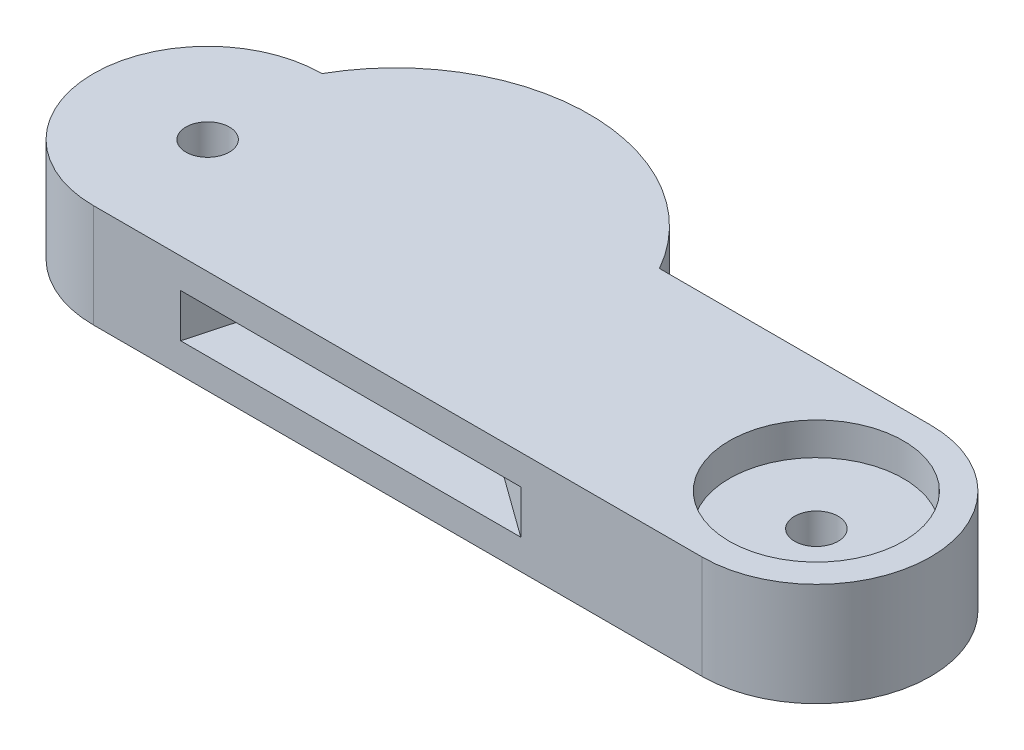
ISO-10303-21;
HEADER;
FILE_DESCRIPTION(('STEP AP214'),'2;1');
FILE_NAME('part.step','',(''),(''),'','','');
FILE_SCHEMA(('AUTOMOTIVE_DESIGN { 1 0 10303 214 1 1 1 1 }'));
ENDSEC;
DATA;
#1=APPLICATION_CONTEXT('core data for automotive mechanical design processes');
#2=APPLICATION_PROTOCOL_DEFINITION('international standard','automotive_design',2000,#1);
#3=PRODUCT_CONTEXT('',#1,'mechanical');
#4=PRODUCT('Part','Part','',(#3));
#5=PRODUCT_RELATED_PRODUCT_CATEGORY('part','',(#4));
#6=PRODUCT_DEFINITION_FORMATION('','',#4);
#7=PRODUCT_DEFINITION_CONTEXT('part definition',#1,'design');
#8=PRODUCT_DEFINITION('design','',#6,#7);
#9=PRODUCT_DEFINITION_SHAPE('','',#8);
#10=(LENGTH_UNIT() NAMED_UNIT(*) SI_UNIT(.MILLI.,.METRE.));
#11=(NAMED_UNIT(*) PLANE_ANGLE_UNIT() SI_UNIT($,.RADIAN.));
#12=(NAMED_UNIT(*) SI_UNIT($,.STERADIAN.) SOLID_ANGLE_UNIT());
#13=UNCERTAINTY_MEASURE_WITH_UNIT(LENGTH_MEASURE(1.E-05),#10,'distance_accuracy_value','');
#14=(GEOMETRIC_REPRESENTATION_CONTEXT(3) GLOBAL_UNCERTAINTY_ASSIGNED_CONTEXT((#13)) GLOBAL_UNIT_ASSIGNED_CONTEXT((#10,
#11,#12)) REPRESENTATION_CONTEXT('',''));
#15=CARTESIAN_POINT('',(0.,0.,0.));
#16=DIRECTION('',(0.,0.,1.));
#17=DIRECTION('',(1.,0.,0.));
#18=AXIS2_PLACEMENT_3D('',#15,#16,#17);
#19=CARTESIAN_POINT('',(0.,4.75,0.));
#20=DIRECTION('',(0.,-1.,0.));
#21=DIRECTION('',(0.,0.,-1.));
#22=AXIS2_PLACEMENT_3D('',#19,#20,#21);
#23=CYLINDRICAL_SURFACE('',#22,2.);
#24=CARTESIAN_POINT('',(0.,-4.75,0.));
#25=DIRECTION('',(0.,1.,0.));
#26=DIRECTION('',(0.,0.,1.));
#27=AXIS2_PLACEMENT_3D('',#24,#25,#26);
#28=CIRCLE('',#27,2.);
#29=CARTESIAN_POINT('',(0.,-4.75,2.));
#30=VERTEX_POINT('',#29);
#31=EDGE_CURVE('E177',#30,#30,#28,.T.);
#32=ORIENTED_EDGE('',*,*,#31,.F.);
#33=EDGE_LOOP('',(#32));
#34=FACE_BOUND('',#33,.T.);
#35=CARTESIAN_POINT('',(0.,1.75,0.));
#36=DIRECTION('',(0.,1.,0.));
#37=DIRECTION('',(0.,0.,1.));
#38=AXIS2_PLACEMENT_3D('',#35,#36,#37);
#39=CIRCLE('',#38,2.);
#40=CARTESIAN_POINT('',(0.,1.75,2.));
#41=VERTEX_POINT('',#40);
#42=EDGE_CURVE('E40',#41,#41,#39,.T.);
#43=ORIENTED_EDGE('',*,*,#42,.T.);
#44=EDGE_LOOP('',(#43));
#45=FACE_BOUND('',#44,.T.);
#46=ADVANCED_FACE('F36',(#34,#45),#23,.F.);
#47=CARTESIAN_POINT('',(-40.424119315667,37.0570550281998,-1.74605110135798));
#48=DIRECTION('',(0.,-1.,0.));
#49=DIRECTION('',(0.,0.,-1.));
#50=AXIS2_PLACEMENT_3D('',#47,#48,#49);
#51=CYLINDRICAL_SURFACE('',#50,17.8069548217707);
#52=CARTESIAN_POINT('',(-40.424119315667,4.75,-1.74605110135798));
#53=DIRECTION('',(0.,1.,0.));
#54=DIRECTION('',(0.,0.,1.));
#55=AXIS2_PLACEMENT_3D('',#52,#53,#54);
#56=CIRCLE('',#55,17.8069548217707);
#57=CARTESIAN_POINT('',(-24.9177003511623,4.75,-10.5003992165423));
#58=VERTEX_POINT('',#57);
#59=CARTESIAN_POINT('',(-55.9305382801716,4.75,-10.5003992165423));
#60=VERTEX_POINT('',#59);
#61=EDGE_CURVE('E153',#58,#60,#56,.T.);
#62=ORIENTED_EDGE('',*,*,#61,.F.);
#63=DIRECTION('',(0.,-1.,0.));
#64=VECTOR('',#63,1.);
#65=CARTESIAN_POINT('',(-24.9177003511623,37.0570550281998,-10.5003992165423));
#66=LINE('',#65,#64);
#67=CARTESIAN_POINT('',(-24.9177003511623,-4.75,-10.5003992165423));
#68=VERTEX_POINT('',#67);
#69=EDGE_CURVE('E152',#58,#68,#66,.T.);
#70=ORIENTED_EDGE('',*,*,#69,.T.);
#71=CARTESIAN_POINT('',(-40.424119315667,-4.75,-1.74605110135798));
#72=DIRECTION('',(0.,1.,0.));
#73=DIRECTION('',(0.,0.,1.));
#74=AXIS2_PLACEMENT_3D('',#71,#72,#73);
#75=CIRCLE('',#74,17.8069548217707);
#76=CARTESIAN_POINT('',(-55.9305382801716,-4.75,-10.5003992165423));
#77=VERTEX_POINT('',#76);
#78=EDGE_CURVE('E148',#77,#68,#75,.F.);
#79=ORIENTED_EDGE('',*,*,#78,.F.);
#80=DIRECTION('',(0.,-1.,0.));
#81=VECTOR('',#80,1.);
#82=CARTESIAN_POINT('',(-55.9305382801716,4.75,-10.5003992165423));
#83=LINE('',#82,#81);
#84=EDGE_CURVE('E208',#60,#77,#83,.T.);
#85=ORIENTED_EDGE('',*,*,#84,.F.);
#86=EDGE_LOOP('',(#62,#70,#79,#85));
#87=FACE_BOUND('',#86,.T.);
#88=CARTESIAN_POINT('',(-40.424119315667,-2.,-1.74605110135798));
#89=DIRECTION('',(0.,1.,0.));
#90=DIRECTION('',(0.,0.,1.));
#91=AXIS2_PLACEMENT_3D('',#88,#89,#90);
#92=CIRCLE('',#91,17.8069548217707);
#93=CARTESIAN_POINT('',(-35.7381547906298,-2.,-18.9253810211969));
#94=VERTEX_POINT('',#93);
#95=CARTESIAN_POINT('',(-54.8543825264001,-2.,-12.1794179449777));
#96=VERTEX_POINT('',#95);
#97=EDGE_CURVE('E123',#94,#96,#92,.T.);
#98=ORIENTED_EDGE('',*,*,#97,.F.);
#99=DIRECTION('',(0.,1.,0.));
#100=VECTOR('',#99,1.);
#101=CARTESIAN_POINT('',(-35.7381547906298,-2.,-18.9253810211969));
#102=LINE('',#101,#100);
#103=CARTESIAN_POINT('',(-35.7381547906298,2.,-18.9253810211969));
#104=VERTEX_POINT('',#103);
#105=EDGE_CURVE('E133',#94,#104,#102,.T.);
#106=ORIENTED_EDGE('',*,*,#105,.T.);
#107=CARTESIAN_POINT('',(-40.424119315667,2.,-1.74605110135798));
#108=DIRECTION('',(0.,1.,0.));
#109=DIRECTION('',(0.,0.,1.));
#110=AXIS2_PLACEMENT_3D('',#107,#108,#109);
#111=CIRCLE('',#110,17.8069548217707);
#112=CARTESIAN_POINT('',(-54.8543825264001,2.,-12.1794179449777));
#113=VERTEX_POINT('',#112);
#114=EDGE_CURVE('E141',#104,#113,#111,.T.);
#115=ORIENTED_EDGE('',*,*,#114,.T.);
#116=DIRECTION('',(0.,1.,0.));
#117=VECTOR('',#116,1.);
#118=CARTESIAN_POINT('',(-54.8543825264001,-2.,-12.1794179449777));
#119=LINE('',#118,#117);
#120=EDGE_CURVE('E138',#96,#113,#119,.T.);
#121=ORIENTED_EDGE('',*,*,#120,.F.);
#122=EDGE_LOOP('',(#98,#106,#115,#121));
#123=FACE_BOUND('',#122,.T.);
#124=ADVANCED_FACE('F140',(#87,#123),#51,.T.);
#125=CARTESIAN_POINT('',(0.,4.75,-10.5003992165423));
#126=DIRECTION('',(0.,0.,1.));
#127=DIRECTION('',(1.,0.,0.));
#128=AXIS2_PLACEMENT_3D('',#125,#126,#127);
#129=PLANE('',#128);
#130=ORIENTED_EDGE('',*,*,#69,.F.);
#131=DIRECTION('',(-1.,0.,0.));
#132=VECTOR('',#131,1.);
#133=CARTESIAN_POINT('',(0.,4.75,-10.5003992165423));
#134=LINE('',#133,#132);
#135=CARTESIAN_POINT('',(0.,4.75,-10.5003992165423));
#136=VERTEX_POINT('',#135);
#137=EDGE_CURVE('E186',#136,#58,#134,.T.);
#138=ORIENTED_EDGE('',*,*,#137,.F.);
#139=DIRECTION('',(0.,-1.,0.));
#140=VECTOR('',#139,1.);
#141=CARTESIAN_POINT('',(0.,4.75,-10.5003992165423));
#142=LINE('',#141,#140);
#143=CARTESIAN_POINT('',(0.,-4.75,-10.5003992165423));
#144=VERTEX_POINT('',#143);
#145=EDGE_CURVE('E211',#136,#144,#142,.T.);
#146=ORIENTED_EDGE('',*,*,#145,.T.);
#147=DIRECTION('',(-1.,0.,0.));
#148=VECTOR('',#147,1.);
#149=CARTESIAN_POINT('',(0.,-4.75,-10.5003992165423));
#150=LINE('',#149,#148);
#151=EDGE_CURVE('E197',#144,#68,#150,.T.);
#152=ORIENTED_EDGE('',*,*,#151,.T.);
#153=EDGE_LOOP('',(#130,#138,#146,#152));
#154=FACE_BOUND('',#153,.T.);
#155=ADVANCED_FACE('F246',(#154),#129,.F.);
#156=CARTESIAN_POINT('',(0.,4.75,10.5003992165423));
#157=DIRECTION('',(0.,0.,-1.));
#158=DIRECTION('',(-1.,0.,0.));
#159=AXIS2_PLACEMENT_3D('',#156,#157,#158);
#160=PLANE('',#159);
#161=DIRECTION('',(1.,0.,0.));
#162=VECTOR('',#161,1.);
#163=CARTESIAN_POINT('',(0.,-4.75,10.5003992165423));
#164=LINE('',#163,#162);
#165=CARTESIAN_POINT('',(-55.9305382801716,-4.75,10.5003992165423));
#166=VERTEX_POINT('',#165);
#167=CARTESIAN_POINT('',(0.,-4.75,10.5003992165423));
#168=VERTEX_POINT('',#167);
#169=EDGE_CURVE('E187',#166,#168,#164,.T.);
#170=ORIENTED_EDGE('',*,*,#169,.T.);
#171=DIRECTION('',(0.,-1.,0.));
#172=VECTOR('',#171,1.);
#173=CARTESIAN_POINT('',(0.,4.75,10.5003992165423));
#174=LINE('',#173,#172);
#175=CARTESIAN_POINT('',(0.,4.75,10.5003992165423));
#176=VERTEX_POINT('',#175);
#177=EDGE_CURVE('E194',#176,#168,#174,.T.);
#178=ORIENTED_EDGE('',*,*,#177,.F.);
#179=DIRECTION('',(1.,0.,0.));
#180=VECTOR('',#179,1.);
#181=CARTESIAN_POINT('',(0.,4.75,10.5003992165423));
#182=LINE('',#181,#180);
#183=CARTESIAN_POINT('',(-55.9305382801716,4.75,10.5003992165423));
#184=VERTEX_POINT('',#183);
#185=EDGE_CURVE('E192',#184,#176,#182,.T.);
#186=ORIENTED_EDGE('',*,*,#185,.F.);
#187=DIRECTION('',(0.,-1.,0.));
#188=VECTOR('',#187,1.);
#189=CARTESIAN_POINT('',(-55.9305382801716,4.75,10.5003992165423));
#190=LINE('',#189,#188);
#191=EDGE_CURVE('E205',#184,#166,#190,.T.);
#192=ORIENTED_EDGE('',*,*,#191,.T.);
#193=EDGE_LOOP('',(#170,#178,#186,#192));
#194=FACE_BOUND('',#193,.T.);
#195=DIRECTION('',(1.,0.,0.));
#196=VECTOR('',#195,1.);
#197=CARTESIAN_POINT('',(0.,-2.,10.5003992165423));
#198=LINE('',#197,#196);
#199=CARTESIAN_POINT('',(-47.9106890267398,-2.,10.5003992165423));
#200=VERTEX_POINT('',#199);
#201=CARTESIAN_POINT('',(-16.6592767209511,-2.,10.5003992165423));
#202=VERTEX_POINT('',#201);
#203=EDGE_CURVE('E11',#200,#202,#198,.T.);
#204=ORIENTED_EDGE('',*,*,#203,.F.);
#205=DIRECTION('',(0.,1.,0.));
#206=VECTOR('',#205,1.);
#207=CARTESIAN_POINT('',(-47.9106890267398,4.75,10.5003992165423));
#208=LINE('',#207,#206);
#209=CARTESIAN_POINT('',(-47.9106890267398,2.,10.5003992165423));
#210=VERTEX_POINT('',#209);
#211=EDGE_CURVE('E217',#200,#210,#208,.T.);
#212=ORIENTED_EDGE('',*,*,#211,.T.);
#213=DIRECTION('',(1.,0.,0.));
#214=VECTOR('',#213,1.);
#215=CARTESIAN_POINT('',(0.,2.,10.5003992165423));
#216=LINE('',#215,#214);
#217=CARTESIAN_POINT('',(-16.6592767209511,2.,10.5003992165423));
#218=VERTEX_POINT('',#217);
#219=EDGE_CURVE('E214',#210,#218,#216,.T.);
#220=ORIENTED_EDGE('',*,*,#219,.T.);
#221=DIRECTION('',(0.,-1.,0.));
#222=VECTOR('',#221,1.);
#223=CARTESIAN_POINT('',(-16.6592767209511,4.75,10.5003992165423));
#224=LINE('',#223,#222);
#225=EDGE_CURVE('E45',#218,#202,#224,.T.);
#226=ORIENTED_EDGE('',*,*,#225,.T.);
#227=EDGE_LOOP('',(#204,#212,#220,#226));
#228=FACE_BOUND('',#227,.T.);
#229=ADVANCED_FACE('F223',(#194,#228),#160,.F.);
#230=CARTESIAN_POINT('',(0.,4.75,0.));
#231=DIRECTION('',(0.,1.,0.));
#232=DIRECTION('',(0.,0.,1.));
#233=AXIS2_PLACEMENT_3D('',#230,#231,#232);
#234=PLANE('',#233);
#235=CARTESIAN_POINT('',(0.,4.75,0.));
#236=DIRECTION('',(0.,1.,0.));
#237=DIRECTION('',(0.,0.,1.));
#238=AXIS2_PLACEMENT_3D('',#235,#236,#237);
#239=CIRCLE('',#238,8.);
#240=CARTESIAN_POINT('',(0.,4.75,8.));
#241=VERTEX_POINT('',#240);
#242=EDGE_CURVE('E145',#241,#241,#239,.T.);
#243=ORIENTED_EDGE('',*,*,#242,.F.);
#244=EDGE_LOOP('',(#243));
#245=FACE_BOUND('',#244,.T.);
#246=CARTESIAN_POINT('',(0.,4.75,0.));
#247=DIRECTION('',(0.,1.,0.));
#248=DIRECTION('',(0.,0.,1.));
#249=AXIS2_PLACEMENT_3D('',#246,#247,#248);
#250=CIRCLE('',#249,10.5003992165423);
#251=EDGE_CURVE('E183',#176,#136,#250,.T.);
#252=ORIENTED_EDGE('',*,*,#251,.T.);
#253=ORIENTED_EDGE('',*,*,#137,.T.);
#254=ORIENTED_EDGE('',*,*,#61,.T.);
#255=CARTESIAN_POINT('',(-55.9305382801716,4.75,0.));
#256=DIRECTION('',(0.,1.,0.));
#257=DIRECTION('',(0.,0.,1.));
#258=AXIS2_PLACEMENT_3D('',#255,#256,#257);
#259=CIRCLE('',#258,10.5003992165423);
#260=EDGE_CURVE('E190',#60,#184,#259,.T.);
#261=ORIENTED_EDGE('',*,*,#260,.T.);
#262=ORIENTED_EDGE('',*,*,#185,.T.);
#263=EDGE_LOOP('',(#252,#253,#254,#261,#262));
#264=FACE_BOUND('',#263,.T.);
#265=CARTESIAN_POINT('',(-55.9305382801716,4.75,0.));
#266=DIRECTION('',(0.,1.,0.));
#267=DIRECTION('',(0.,0.,1.));
#268=AXIS2_PLACEMENT_3D('',#265,#266,#267);
#269=CIRCLE('',#268,2.);
#270=CARTESIAN_POINT('',(-55.9305382801716,4.75,2.));
#271=VERTEX_POINT('',#270);
#272=EDGE_CURVE('E174',#271,#271,#269,.T.);
#273=ORIENTED_EDGE('',*,*,#272,.F.);
#274=EDGE_LOOP('',(#273));
#275=FACE_BOUND('',#274,.T.);
#276=ADVANCED_FACE('F255',(#245,#264,#275),#234,.T.);
#277=CARTESIAN_POINT('',(0.,-4.75,0.));
#278=DIRECTION('',(0.,1.,0.));
#279=DIRECTION('',(0.,0.,1.));
#280=AXIS2_PLACEMENT_3D('',#277,#278,#279);
#281=PLANE('',#280);
#282=CARTESIAN_POINT('',(0.,-4.75,0.));
#283=DIRECTION('',(0.,1.,0.));
#284=DIRECTION('',(0.,0.,1.));
#285=AXIS2_PLACEMENT_3D('',#282,#283,#284);
#286=CIRCLE('',#285,10.5003992165423);
#287=EDGE_CURVE('E182',#168,#144,#286,.T.);
#288=ORIENTED_EDGE('',*,*,#287,.F.);
#289=ORIENTED_EDGE('',*,*,#169,.F.);
#290=CARTESIAN_POINT('',(-55.9305382801716,-4.75,0.));
#291=DIRECTION('',(0.,1.,0.));
#292=DIRECTION('',(0.,0.,1.));
#293=AXIS2_PLACEMENT_3D('',#290,#291,#292);
#294=CIRCLE('',#293,10.5003992165423);
#295=EDGE_CURVE('E200',#77,#166,#294,.T.);
#296=ORIENTED_EDGE('',*,*,#295,.F.);
#297=ORIENTED_EDGE('',*,*,#78,.T.);
#298=ORIENTED_EDGE('',*,*,#151,.F.);
#299=EDGE_LOOP('',(#288,#289,#296,#297,#298));
#300=FACE_BOUND('',#299,.T.);
#301=ORIENTED_EDGE('',*,*,#31,.T.);
#302=EDGE_LOOP('',(#301));
#303=FACE_BOUND('',#302,.T.);
#304=CARTESIAN_POINT('',(-55.9305382801716,-4.75,0.));
#305=DIRECTION('',(0.,1.,0.));
#306=DIRECTION('',(0.,0.,1.));
#307=AXIS2_PLACEMENT_3D('',#304,#305,#306);
#308=CIRCLE('',#307,2.);
#309=CARTESIAN_POINT('',(-55.9305382801716,-4.75,2.));
#310=VERTEX_POINT('',#309);
#311=EDGE_CURVE('E172',#310,#310,#308,.T.);
#312=ORIENTED_EDGE('',*,*,#311,.T.);
#313=EDGE_LOOP('',(#312));
#314=FACE_BOUND('',#313,.T.);
#315=ADVANCED_FACE('F258',(#300,#303,#314),#281,.F.);
#316=CARTESIAN_POINT('',(0.,4.75,0.));
#317=DIRECTION('',(0.,-1.,0.));
#318=DIRECTION('',(0.,0.,-1.));
#319=AXIS2_PLACEMENT_3D('',#316,#317,#318);
#320=CYLINDRICAL_SURFACE('',#319,10.5003992165423);
#321=ORIENTED_EDGE('',*,*,#287,.T.);
#322=ORIENTED_EDGE('',*,*,#145,.F.);
#323=ORIENTED_EDGE('',*,*,#251,.F.);
#324=ORIENTED_EDGE('',*,*,#177,.T.);
#325=EDGE_LOOP('',(#321,#322,#323,#324));
#326=FACE_BOUND('',#325,.T.);
#327=ADVANCED_FACE('F38',(#326),#320,.T.);
#328=CARTESIAN_POINT('',(-55.9305382801716,4.75,0.));
#329=DIRECTION('',(0.,-1.,0.));
#330=DIRECTION('',(0.,0.,-1.));
#331=AXIS2_PLACEMENT_3D('',#328,#329,#330);
#332=CYLINDRICAL_SURFACE('',#331,10.5003992165423);
#333=ORIENTED_EDGE('',*,*,#295,.T.);
#334=ORIENTED_EDGE('',*,*,#191,.F.);
#335=ORIENTED_EDGE('',*,*,#260,.F.);
#336=ORIENTED_EDGE('',*,*,#84,.T.);
#337=EDGE_LOOP('',(#333,#334,#335,#336));
#338=FACE_BOUND('',#337,.T.);
#339=ADVANCED_FACE('F266',(#338),#332,.T.);
#340=CARTESIAN_POINT('',(-55.9305382801716,4.75,0.));
#341=DIRECTION('',(0.,-1.,0.));
#342=DIRECTION('',(0.,0.,-1.));
#343=AXIS2_PLACEMENT_3D('',#340,#341,#342);
#344=CYLINDRICAL_SURFACE('',#343,2.);
#345=ORIENTED_EDGE('',*,*,#272,.T.);
#346=EDGE_LOOP('',(#345));
#347=FACE_BOUND('',#346,.T.);
#348=ORIENTED_EDGE('',*,*,#311,.F.);
#349=EDGE_LOOP('',(#348));
#350=FACE_BOUND('',#349,.T.);
#351=ADVANCED_FACE('F253',(#347,#350),#344,.F.);
#352=CARTESIAN_POINT('',(-43.8872651072946,-2.,-4.24997427651625));
#353=DIRECTION('',(-0.585915275691268,0.,0.810372315489384));
#354=DIRECTION('',(0.810372315489384,0.,0.585915275691268));
#355=AXIS2_PLACEMENT_3D('',#352,#353,#354);
#356=PLANE('',#355);
#357=DIRECTION('',(0.810372315489384,0.,0.585915275691268));
#358=VECTOR('',#357,1.);
#359=CARTESIAN_POINT('',(-43.8872651072946,2.,-4.24997427651625));
#360=LINE('',#359,#358);
#361=CARTESIAN_POINT('',(-43.8872651072946,2.,-4.24997427651625));
#362=VERTEX_POINT('',#361);
#363=EDGE_CURVE('E52',#113,#362,#360,.T.);
#364=ORIENTED_EDGE('',*,*,#363,.T.);
#365=DIRECTION('',(0.,1.,0.));
#366=VECTOR('',#365,1.);
#367=CARTESIAN_POINT('',(-43.8872651072946,-2.,-4.24997427651625));
#368=LINE('',#367,#366);
#369=CARTESIAN_POINT('',(-43.8872651072946,-2.,-4.24997427651625));
#370=VERTEX_POINT('',#369);
#371=EDGE_CURVE('E169',#370,#362,#368,.T.);
#372=ORIENTED_EDGE('',*,*,#371,.F.);
#373=DIRECTION('',(0.810372315489384,0.,0.585915275691268));
#374=VECTOR('',#373,1.);
#375=CARTESIAN_POINT('',(-43.8872651072946,-2.,-4.24997427651625));
#376=LINE('',#375,#374);
#377=EDGE_CURVE('E130',#96,#370,#376,.T.);
#378=ORIENTED_EDGE('',*,*,#377,.F.);
#379=ORIENTED_EDGE('',*,*,#120,.T.);
#380=EDGE_LOOP('',(#364,#372,#378,#379));
#381=FACE_BOUND('',#380,.T.);
#382=ADVANCED_FACE('F291',(#381),#356,.F.);
#383=CARTESIAN_POINT('',(-35.7518279113761,-2.,-18.8752536565784));
#384=DIRECTION('',(0.964753945398661,0.,0.263153614525274));
#385=DIRECTION('',(0.263153614525274,0.,-0.964753945398661));
#386=AXIS2_PLACEMENT_3D('',#383,#384,#385);
#387=PLANE('',#386);
#388=DIRECTION('',(0.263153614525274,0.,-0.964753945398661));
#389=VECTOR('',#388,1.);
#390=CARTESIAN_POINT('',(-35.7518279113761,-2.,-18.8752536565784));
#391=LINE('',#390,#389);
#392=CARTESIAN_POINT('',(-39.2995259463285,-2.,-5.86895054165513));
#393=VERTEX_POINT('',#392);
#394=EDGE_CURVE('E119',#393,#94,#391,.T.);
#395=ORIENTED_EDGE('',*,*,#394,.F.);
#396=DIRECTION('',(0.,1.,0.));
#397=VECTOR('',#396,1.);
#398=CARTESIAN_POINT('',(-39.2995259463285,-2.,-5.86895054165513));
#399=LINE('',#398,#397);
#400=CARTESIAN_POINT('',(-39.2995259463285,2.,-5.86895054165513));
#401=VERTEX_POINT('',#400);
#402=EDGE_CURVE('E163',#393,#401,#399,.T.);
#403=ORIENTED_EDGE('',*,*,#402,.T.);
#404=DIRECTION('',(0.263153614525274,0.,-0.964753945398661));
#405=VECTOR('',#404,1.);
#406=CARTESIAN_POINT('',(-35.7518279113761,2.,-18.8752536565784));
#407=LINE('',#406,#405);
#408=EDGE_CURVE('E135',#401,#104,#407,.T.);
#409=ORIENTED_EDGE('',*,*,#408,.T.);
#410=ORIENTED_EDGE('',*,*,#105,.F.);
#411=EDGE_LOOP('',(#395,#403,#409,#410));
#412=FACE_BOUND('',#411,.T.);
#413=ADVANCED_FACE('F134',(#412),#387,.F.);
#414=CARTESIAN_POINT('',(26.6452391554762,-2.,41.8104240945407));
#415=DIRECTION('',(0.585915275691268,0.,-0.810372315489384));
#416=DIRECTION('',(-0.810372315489384,0.,-0.585915275691268));
#417=AXIS2_PLACEMENT_3D('',#414,#415,#416);
#418=PLANE('',#417);
#419=DIRECTION('',(-0.810372315489384,0.,-0.585915275691268));
#420=VECTOR('',#419,1.);
#421=CARTESIAN_POINT('',(26.6452391554762,2.,41.8104240945407));
#422=LINE('',#421,#420);
#423=EDGE_CURVE('E59',#218,#401,#422,.T.);
#424=ORIENTED_EDGE('',*,*,#423,.T.);
#425=ORIENTED_EDGE('',*,*,#402,.F.);
#426=DIRECTION('',(-0.810372315489384,0.,-0.585915275691268));
#427=VECTOR('',#426,1.);
#428=CARTESIAN_POINT('',(26.6452391554762,-2.,41.8104240945407));
#429=LINE('',#428,#427);
#430=EDGE_CURVE('E126',#202,#393,#429,.T.);
#431=ORIENTED_EDGE('',*,*,#430,.F.);
#432=ORIENTED_EDGE('',*,*,#225,.F.);
#433=EDGE_LOOP('',(#424,#425,#431,#432));
#434=FACE_BOUND('',#433,.T.);
#435=ADVANCED_FACE('F225',(#434),#418,.F.);
#436=CARTESIAN_POINT('',(-43.8872651072946,-2.,-4.24997427651625));
#437=DIRECTION('',(-0.964753945398661,0.,-0.263153614525275));
#438=DIRECTION('',(-0.263153614525275,0.,0.964753945398661));
#439=AXIS2_PLACEMENT_3D('',#436,#437,#438);
#440=PLANE('',#439);
#441=DIRECTION('',(-0.263153614525275,0.,0.964753945398661));
#442=VECTOR('',#441,1.);
#443=CARTESIAN_POINT('',(-43.8872651072946,-2.,-4.24997427651625));
#444=LINE('',#443,#442);
#445=EDGE_CURVE('E160',#370,#200,#444,.T.);
#446=ORIENTED_EDGE('',*,*,#445,.F.);
#447=ORIENTED_EDGE('',*,*,#371,.T.);
#448=DIRECTION('',(-0.263153614525275,0.,0.964753945398661));
#449=VECTOR('',#448,1.);
#450=CARTESIAN_POINT('',(-43.8872651072946,2.,-4.24997427651625));
#451=LINE('',#450,#449);
#452=EDGE_CURVE('E157',#362,#210,#451,.T.);
#453=ORIENTED_EDGE('',*,*,#452,.T.);
#454=ORIENTED_EDGE('',*,*,#211,.F.);
#455=EDGE_LOOP('',(#446,#447,#453,#454));
#456=FACE_BOUND('',#455,.T.);
#457=ADVANCED_FACE('F237',(#456),#440,.F.);
#458=CARTESIAN_POINT('',(-41.5933955268116,-2.,-5.0594624090857));
#459=DIRECTION('',(0.,1.,0.));
#460=DIRECTION('',(0.,0.,1.));
#461=AXIS2_PLACEMENT_3D('',#458,#459,#460);
#462=PLANE('',#461);
#463=ORIENTED_EDGE('',*,*,#394,.T.);
#464=ORIENTED_EDGE('',*,*,#97,.T.);
#465=ORIENTED_EDGE('',*,*,#377,.T.);
#466=ORIENTED_EDGE('',*,*,#445,.T.);
#467=ORIENTED_EDGE('',*,*,#203,.T.);
#468=ORIENTED_EDGE('',*,*,#430,.T.);
#469=EDGE_LOOP('',(#463,#464,#465,#466,#467,#468));
#470=FACE_BOUND('',#469,.T.);
#471=ADVANCED_FACE('F121',(#470),#462,.T.);
#472=CARTESIAN_POINT('',(-41.5933955268116,2.,-5.0594624090857));
#473=DIRECTION('',(0.,1.,0.));
#474=DIRECTION('',(0.,0.,1.));
#475=AXIS2_PLACEMENT_3D('',#472,#473,#474);
#476=PLANE('',#475);
#477=ORIENTED_EDGE('',*,*,#408,.F.);
#478=ORIENTED_EDGE('',*,*,#423,.F.);
#479=ORIENTED_EDGE('',*,*,#219,.F.);
#480=ORIENTED_EDGE('',*,*,#452,.F.);
#481=ORIENTED_EDGE('',*,*,#363,.F.);
#482=ORIENTED_EDGE('',*,*,#114,.F.);
#483=EDGE_LOOP('',(#477,#478,#479,#480,#481,#482));
#484=FACE_BOUND('',#483,.T.);
#485=ADVANCED_FACE('F226',(#484),#476,.F.);
#486=CARTESIAN_POINT('',(0.,1.75,0.));
#487=DIRECTION('',(0.,1.,0.));
#488=DIRECTION('',(0.,0.,1.));
#489=AXIS2_PLACEMENT_3D('',#486,#487,#488);
#490=CYLINDRICAL_SURFACE('',#489,8.);
#491=CARTESIAN_POINT('',(0.,1.75,0.));
#492=DIRECTION('',(0.,1.,0.));
#493=DIRECTION('',(0.,0.,1.));
#494=AXIS2_PLACEMENT_3D('',#491,#492,#493);
#495=CIRCLE('',#494,8.);
#496=CARTESIAN_POINT('',(0.,1.75,8.));
#497=VERTEX_POINT('',#496);
#498=EDGE_CURVE('E362',#497,#497,#495,.T.);
#499=ORIENTED_EDGE('',*,*,#498,.F.);
#500=EDGE_LOOP('',(#499));
#501=FACE_BOUND('',#500,.T.);
#502=ORIENTED_EDGE('',*,*,#242,.T.);
#503=EDGE_LOOP('',(#502));
#504=FACE_BOUND('',#503,.T.);
#505=ADVANCED_FACE('F228',(#501,#504),#490,.F.);
#506=CARTESIAN_POINT('',(0.,1.75,0.));
#507=DIRECTION('',(0.,1.,0.));
#508=DIRECTION('',(0.,0.,1.));
#509=AXIS2_PLACEMENT_3D('',#506,#507,#508);
#510=PLANE('',#509);
#511=ORIENTED_EDGE('',*,*,#42,.F.);
#512=EDGE_LOOP('',(#511));
#513=FACE_BOUND('',#512,.T.);
#514=ORIENTED_EDGE('',*,*,#498,.T.);
#515=EDGE_LOOP('',(#514));
#516=FACE_BOUND('',#515,.T.);
#517=ADVANCED_FACE('F234',(#513,#516),#510,.T.);
#518=CLOSED_SHELL('',(#46,#124,#155,#229,#276,#315,#327,#339,#351,#382,#413,#435,#457,#471,#485,
#505,#517));
#519=MANIFOLD_SOLID_BREP('B2',#518);
#520=ADVANCED_BREP_SHAPE_REPRESENTATION('',(#18,#519),#14);
#521=SHAPE_DEFINITION_REPRESENTATION(#9,#520);
ENDSEC;
END-ISO-10303-21;
